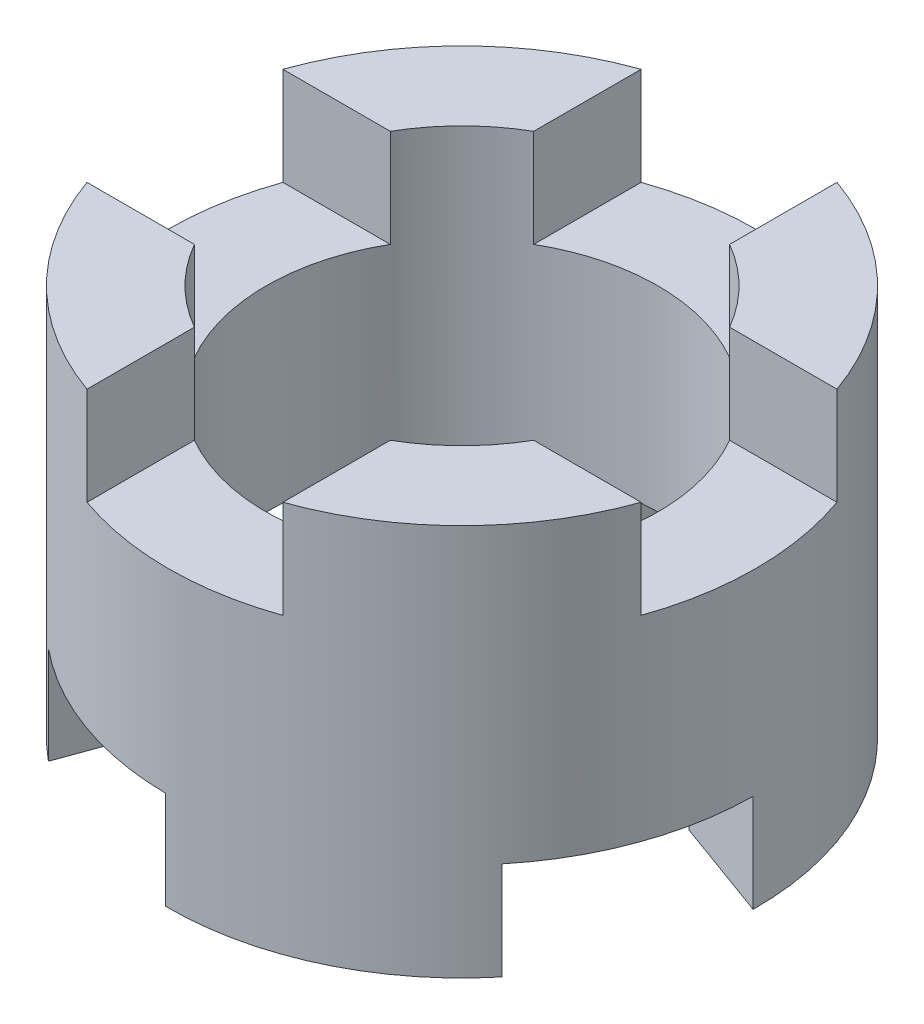
ISO-10303-21;
HEADER;
FILE_DESCRIPTION(('STEP AP214'),'2;1');
FILE_NAME('part.step','',(''),(''),'','','');
FILE_SCHEMA(('AUTOMOTIVE_DESIGN { 1 0 10303 214 1 1 1 1 }'));
ENDSEC;
DATA;
#1=APPLICATION_CONTEXT('core data for automotive mechanical design processes');
#2=APPLICATION_PROTOCOL_DEFINITION('international standard','automotive_design',2000,#1);
#3=PRODUCT_CONTEXT('',#1,'mechanical');
#4=PRODUCT('Part','Part','',(#3));
#5=PRODUCT_RELATED_PRODUCT_CATEGORY('part','',(#4));
#6=PRODUCT_DEFINITION_FORMATION('','',#4);
#7=PRODUCT_DEFINITION_CONTEXT('part definition',#1,'design');
#8=PRODUCT_DEFINITION('design','',#6,#7);
#9=PRODUCT_DEFINITION_SHAPE('','',#8);
#10=(LENGTH_UNIT() NAMED_UNIT(*) SI_UNIT(.MILLI.,.METRE.));
#11=(NAMED_UNIT(*) PLANE_ANGLE_UNIT() SI_UNIT($,.RADIAN.));
#12=(NAMED_UNIT(*) SI_UNIT($,.STERADIAN.) SOLID_ANGLE_UNIT());
#13=UNCERTAINTY_MEASURE_WITH_UNIT(LENGTH_MEASURE(1.E-05),#10,'distance_accuracy_value','');
#14=(GEOMETRIC_REPRESENTATION_CONTEXT(3) GLOBAL_UNCERTAINTY_ASSIGNED_CONTEXT((#13)) GLOBAL_UNIT_ASSIGNED_CONTEXT((#10,
#11,#12)) REPRESENTATION_CONTEXT('',''));
#15=CARTESIAN_POINT('',(0.,0.,0.));
#16=DIRECTION('',(0.,0.,1.));
#17=DIRECTION('',(1.,0.,0.));
#18=AXIS2_PLACEMENT_3D('',#15,#16,#17);
#19=CARTESIAN_POINT('',(0.,0.,0.));
#20=DIRECTION('',(0.,1.,0.));
#21=DIRECTION('',(0.,0.,1.));
#22=AXIS2_PLACEMENT_3D('',#19,#20,#21);
#23=PLANE('',#22);
#24=DIRECTION('',(0.342020143325653,0.,-0.939692620785914));
#25=VECTOR('',#24,1.);
#26=CARTESIAN_POINT('',(-7.03849959341292,0.,37.9042766407801));
#27=LINE('',#26,#25);
#28=CARTESIAN_POINT('',(-0.175808829267726,0.,19.0491887295903));
#29=VERTEX_POINT('',#28);
#30=CARTESIAN_POINT('',(2.20533185637023,0.,12.507058463255));
#31=VERTEX_POINT('',#30);
#32=EDGE_CURVE('E268',#29,#31,#27,.T.);
#33=ORIENTED_EDGE('',*,*,#32,.T.);
#34=CARTESIAN_POINT('',(0.,0.,0.));
#35=DIRECTION('',(0.,1.,0.));
#36=DIRECTION('',(0.,0.,1.));
#37=AXIS2_PLACEMENT_3D('',#34,#35,#36);
#38=CIRCLE('',#37,12.7);
#39=CARTESIAN_POINT('',(8.16340264301918,0.,9.72876442761091));
#40=VERTEX_POINT('',#39);
#41=EDGE_CURVE('E488',#31,#40,#38,.T.);
#42=ORIENTED_EDGE('',*,*,#41,.T.);
#43=DIRECTION('',(0.939692620785913,0.,0.342020143325656));
#44=VECTOR('',#43,1.);
#45=CARTESIAN_POINT('',(-37.90427664078,0.,-7.03849959341306));
#46=LINE('',#45,#44);
#47=CARTESIAN_POINT('',(14.7055329093545,0.,12.1099051132489));
#48=VERTEX_POINT('',#47);
#49=EDGE_CURVE('E415',#40,#48,#46,.T.);
#50=ORIENTED_EDGE('',*,*,#49,.T.);
#51=CARTESIAN_POINT('',(0.,0.,0.));
#52=DIRECTION('',(0.,1.,0.));
#53=DIRECTION('',(0.,0.,1.));
#54=AXIS2_PLACEMENT_3D('',#51,#52,#53);
#55=CIRCLE('',#54,19.05);
#56=EDGE_CURVE('E275',#29,#48,#55,.T.);
#57=ORIENTED_EDGE('',*,*,#56,.F.);
#58=EDGE_LOOP('',(#33,#42,#50,#57));
#59=FACE_BOUND('',#58,.T.);
#60=ADVANCED_FACE('F41',(#59),#23,.F.);
#61=CARTESIAN_POINT('',(0.,25.4,0.));
#62=DIRECTION('',(0.,-1.,0.));
#63=DIRECTION('',(0.,0.,-1.));
#64=AXIS2_PLACEMENT_3D('',#61,#62,#63);
#65=CYLINDRICAL_SURFACE('',#64,19.05);
#66=CARTESIAN_POINT('',(0.,19.05,0.));
#67=DIRECTION('',(0.,-1.,0.));
#68=DIRECTION('',(0.,0.,-1.));
#69=AXIS2_PLACEMENT_3D('',#66,#67,#68);
#70=CIRCLE('',#69,19.05);
#71=CARTESIAN_POINT('',(6.35000000000006,19.05,17.9605122421383));
#72=VERTEX_POINT('',#71);
#73=CARTESIAN_POINT('',(-6.34999999999994,19.05,17.9605122421383));
#74=VERTEX_POINT('',#73);
#75=EDGE_CURVE('E447',#72,#74,#70,.T.);
#76=ORIENTED_EDGE('',*,*,#75,.T.);
#77=DIRECTION('',(0.,-1.,0.));
#78=VECTOR('',#77,1.);
#79=CARTESIAN_POINT('',(-6.34999999999994,25.4,17.9605122421383));
#80=LINE('',#79,#78);
#81=CARTESIAN_POINT('',(-6.34999999999994,25.4,17.9605122421383));
#82=VERTEX_POINT('',#81);
#83=EDGE_CURVE('E454',#74,#82,#80,.F.);
#84=ORIENTED_EDGE('',*,*,#83,.T.);
#85=CARTESIAN_POINT('',(0.,25.4,0.));
#86=DIRECTION('',(0.,1.,0.));
#87=DIRECTION('',(0.,0.,1.));
#88=AXIS2_PLACEMENT_3D('',#85,#86,#87);
#89=CIRCLE('',#88,19.05);
#90=CARTESIAN_POINT('',(-17.9605122421383,25.4,6.34999999999999));
#91=VERTEX_POINT('',#90);
#92=EDGE_CURVE('E286',#91,#82,#89,.T.);
#93=ORIENTED_EDGE('',*,*,#92,.F.);
#94=DIRECTION('',(0.,-1.,0.));
#95=VECTOR('',#94,1.);
#96=CARTESIAN_POINT('',(-17.9605122421383,25.4,6.34999999999999));
#97=LINE('',#96,#95);
#98=CARTESIAN_POINT('',(-17.9605122421383,19.05,6.34999999999999));
#99=VERTEX_POINT('',#98);
#100=EDGE_CURVE('E479',#91,#99,#97,.T.);
#101=ORIENTED_EDGE('',*,*,#100,.T.);
#102=CARTESIAN_POINT('',(0.,19.05,0.));
#103=DIRECTION('',(0.,-1.,0.));
#104=DIRECTION('',(0.,0.,-1.));
#105=AXIS2_PLACEMENT_3D('',#102,#103,#104);
#106=CIRCLE('',#105,19.05);
#107=CARTESIAN_POINT('',(-17.9605122421383,19.05,-6.35));
#108=VERTEX_POINT('',#107);
#109=EDGE_CURVE('E472',#99,#108,#106,.T.);
#110=ORIENTED_EDGE('',*,*,#109,.T.);
#111=DIRECTION('',(0.,-1.,0.));
#112=VECTOR('',#111,1.);
#113=CARTESIAN_POINT('',(-17.9605122421383,25.4,-6.35));
#114=LINE('',#113,#112);
#115=CARTESIAN_POINT('',(-17.9605122421383,25.4,-6.35));
#116=VERTEX_POINT('',#115);
#117=EDGE_CURVE('E482',#108,#116,#114,.F.);
#118=ORIENTED_EDGE('',*,*,#117,.T.);
#119=CARTESIAN_POINT('',(-6.35000000000007,25.4,-17.9605122421383));
#120=VERTEX_POINT('',#119);
#121=EDGE_CURVE('E287',#120,#116,#89,.T.);
#122=ORIENTED_EDGE('',*,*,#121,.F.);
#123=DIRECTION('',(0.,-1.,0.));
#124=VECTOR('',#123,1.);
#125=CARTESIAN_POINT('',(-6.35000000000007,25.4,-17.9605122421383));
#126=LINE('',#125,#124);
#127=CARTESIAN_POINT('',(-6.35000000000007,19.05,-17.9605122421383));
#128=VERTEX_POINT('',#127);
#129=EDGE_CURVE('E457',#120,#128,#126,.T.);
#130=ORIENTED_EDGE('',*,*,#129,.T.);
#131=CARTESIAN_POINT('',(6.34999999999993,19.05,-17.9605122421383));
#132=VERTEX_POINT('',#131);
#133=EDGE_CURVE('E444',#128,#132,#70,.T.);
#134=ORIENTED_EDGE('',*,*,#133,.T.);
#135=DIRECTION('',(0.,-1.,0.));
#136=VECTOR('',#135,1.);
#137=CARTESIAN_POINT('',(6.34999999999993,25.4,-17.9605122421383));
#138=LINE('',#137,#136);
#139=CARTESIAN_POINT('',(6.34999999999993,25.4,-17.9605122421383));
#140=VERTEX_POINT('',#139);
#141=EDGE_CURVE('E448',#132,#140,#138,.F.);
#142=ORIENTED_EDGE('',*,*,#141,.T.);
#143=CARTESIAN_POINT('',(17.9605122421383,25.4,-6.35000000000001));
#144=VERTEX_POINT('',#143);
#145=EDGE_CURVE('E294',#144,#140,#89,.T.);
#146=ORIENTED_EDGE('',*,*,#145,.F.);
#147=DIRECTION('',(0.,-1.,0.));
#148=VECTOR('',#147,1.);
#149=CARTESIAN_POINT('',(17.9605122421383,25.4,-6.35000000000001));
#150=LINE('',#149,#148);
#151=CARTESIAN_POINT('',(17.9605122421383,19.05,-6.35000000000001));
#152=VERTEX_POINT('',#151);
#153=EDGE_CURVE('E485',#144,#152,#150,.T.);
#154=ORIENTED_EDGE('',*,*,#153,.T.);
#155=CARTESIAN_POINT('',(17.9605122421383,19.05,6.34999999999999));
#156=VERTEX_POINT('',#155);
#157=EDGE_CURVE('E475',#152,#156,#106,.T.);
#158=ORIENTED_EDGE('',*,*,#157,.T.);
#159=DIRECTION('',(0.,-1.,0.));
#160=VECTOR('',#159,1.);
#161=CARTESIAN_POINT('',(17.9605122421383,25.4,6.34999999999999));
#162=LINE('',#161,#160);
#163=CARTESIAN_POINT('',(17.9605122421383,25.4,6.34999999999999));
#164=VERTEX_POINT('',#163);
#165=EDGE_CURVE('E476',#156,#164,#162,.F.);
#166=ORIENTED_EDGE('',*,*,#165,.T.);
#167=CARTESIAN_POINT('',(6.35000000000006,25.4,17.9605122421383));
#168=VERTEX_POINT('',#167);
#169=EDGE_CURVE('E282',#168,#164,#89,.T.);
#170=ORIENTED_EDGE('',*,*,#169,.F.);
#171=DIRECTION('',(0.,-1.,0.));
#172=VECTOR('',#171,1.);
#173=CARTESIAN_POINT('',(6.35000000000006,25.4,17.9605122421383));
#174=LINE('',#173,#172);
#175=EDGE_CURVE('E451',#168,#72,#174,.T.);
#176=ORIENTED_EDGE('',*,*,#175,.T.);
#177=EDGE_LOOP('',(#76,#84,#93,#101,#110,#118,#122,#130,#134,#142,#146,#154,#158,#166,#170,#176));
#178=FACE_BOUND('',#177,.T.);
#179=DIRECTION('',(0.,-1.,0.));
#180=VECTOR('',#179,1.);
#181=CARTESIAN_POINT('',(-0.175808829267726,25.4,19.0491887295903));
#182=LINE('',#181,#180);
#183=CARTESIAN_POINT('',(-0.175808829267726,6.35,19.0491887295903));
#184=VERTEX_POINT('',#183);
#185=EDGE_CURVE('E396',#29,#184,#182,.F.);
#186=ORIENTED_EDGE('',*,*,#185,.F.);
#187=ORIENTED_EDGE('',*,*,#56,.T.);
#188=DIRECTION('',(0.,-1.,0.));
#189=VECTOR('',#188,1.);
#190=CARTESIAN_POINT('',(14.7055329093545,25.4,12.1099051132489));
#191=LINE('',#190,#189);
#192=CARTESIAN_POINT('',(14.7055329093545,6.35,12.1099051132489));
#193=VERTEX_POINT('',#192);
#194=EDGE_CURVE('E427',#193,#48,#191,.T.);
#195=ORIENTED_EDGE('',*,*,#194,.F.);
#196=CARTESIAN_POINT('',(0.,6.35,0.));
#197=DIRECTION('',(0.,-1.,0.));
#198=DIRECTION('',(0.,0.,-1.));
#199=AXIS2_PLACEMENT_3D('',#196,#197,#198);
#200=CIRCLE('',#199,19.05);
#201=CARTESIAN_POINT('',(19.0491887295903,6.35,0.175808829267793));
#202=VERTEX_POINT('',#201);
#203=EDGE_CURVE('E420',#202,#193,#200,.T.);
#204=ORIENTED_EDGE('',*,*,#203,.F.);
#205=DIRECTION('',(0.,-1.,0.));
#206=VECTOR('',#205,1.);
#207=CARTESIAN_POINT('',(19.0491887295903,25.4,0.175808829267794));
#208=LINE('',#207,#206);
#209=CARTESIAN_POINT('',(19.0491887295903,0.,0.175808829267793));
#210=VERTEX_POINT('',#209);
#211=EDGE_CURVE('E424',#202,#210,#208,.T.);
#212=ORIENTED_EDGE('',*,*,#211,.T.);
#213=CARTESIAN_POINT('',(12.1099051132488,0.,-14.7055329093545));
#214=VERTEX_POINT('',#213);
#215=EDGE_CURVE('E277',#210,#214,#55,.T.);
#216=ORIENTED_EDGE('',*,*,#215,.T.);
#217=DIRECTION('',(0.,-1.,0.));
#218=VECTOR('',#217,1.);
#219=CARTESIAN_POINT('',(12.1099051132488,25.4,-14.7055329093545));
#220=LINE('',#219,#218);
#221=CARTESIAN_POINT('',(12.1099051132488,6.35,-14.7055329093545));
#222=VERTEX_POINT('',#221);
#223=EDGE_CURVE('E398',#222,#214,#220,.T.);
#224=ORIENTED_EDGE('',*,*,#223,.F.);
#225=CARTESIAN_POINT('',(0.,6.35,0.));
#226=DIRECTION('',(0.,-1.,0.));
#227=DIRECTION('',(0.,0.,-1.));
#228=AXIS2_PLACEMENT_3D('',#225,#226,#227);
#229=CIRCLE('',#228,19.05);
#230=CARTESIAN_POINT('',(0.175808829267731,6.35,-19.0491887295903));
#231=VERTEX_POINT('',#230);
#232=EDGE_CURVE('E400',#231,#222,#229,.T.);
#233=ORIENTED_EDGE('',*,*,#232,.F.);
#234=DIRECTION('',(0.,-1.,0.));
#235=VECTOR('',#234,1.);
#236=CARTESIAN_POINT('',(0.17580882926773,25.4,-19.0491887295903));
#237=LINE('',#236,#235);
#238=CARTESIAN_POINT('',(0.17580882926773,0.,-19.0491887295903));
#239=VERTEX_POINT('',#238);
#240=EDGE_CURVE('E258',#231,#239,#237,.T.);
#241=ORIENTED_EDGE('',*,*,#240,.T.);
#242=CARTESIAN_POINT('',(-14.7055329093545,0.,-12.1099051132489));
#243=VERTEX_POINT('',#242);
#244=EDGE_CURVE('E274',#239,#243,#55,.T.);
#245=ORIENTED_EDGE('',*,*,#244,.T.);
#246=DIRECTION('',(0.,-1.,0.));
#247=VECTOR('',#246,1.);
#248=CARTESIAN_POINT('',(-14.7055329093545,25.4,-12.1099051132489));
#249=LINE('',#248,#247);
#250=CARTESIAN_POINT('',(-14.7055329093545,6.35,-12.1099051132489));
#251=VERTEX_POINT('',#250);
#252=EDGE_CURVE('E421',#243,#251,#249,.F.);
#253=ORIENTED_EDGE('',*,*,#252,.T.);
#254=CARTESIAN_POINT('',(-19.0491887295903,6.35,-0.175808829267795));
#255=VERTEX_POINT('',#254);
#256=EDGE_CURVE('E418',#255,#251,#200,.T.);
#257=ORIENTED_EDGE('',*,*,#256,.F.);
#258=DIRECTION('',(0.,-1.,0.));
#259=VECTOR('',#258,1.);
#260=CARTESIAN_POINT('',(-19.0491887295903,25.4,-0.175808829267794));
#261=LINE('',#260,#259);
#262=CARTESIAN_POINT('',(-19.0491887295903,0.,-0.175808829267795));
#263=VERTEX_POINT('',#262);
#264=EDGE_CURVE('E273',#263,#255,#261,.F.);
#265=ORIENTED_EDGE('',*,*,#264,.F.);
#266=CARTESIAN_POINT('',(-12.1099051132488,0.,14.7055329093545));
#267=VERTEX_POINT('',#266);
#268=EDGE_CURVE('E265',#263,#267,#55,.T.);
#269=ORIENTED_EDGE('',*,*,#268,.T.);
#270=DIRECTION('',(0.,-1.,0.));
#271=VECTOR('',#270,1.);
#272=CARTESIAN_POINT('',(-12.1099051132488,25.4,14.7055329093545));
#273=LINE('',#272,#271);
#274=CARTESIAN_POINT('',(-12.1099051132488,6.35,14.7055329093545));
#275=VERTEX_POINT('',#274);
#276=EDGE_CURVE('E250',#267,#275,#273,.F.);
#277=ORIENTED_EDGE('',*,*,#276,.T.);
#278=EDGE_CURVE('E402',#184,#275,#229,.T.);
#279=ORIENTED_EDGE('',*,*,#278,.F.);
#280=EDGE_LOOP('',(#186,#187,#195,#204,#212,#216,#224,#233,#241,#245,#253,#257,#265,#269,#277,#279));
#281=FACE_BOUND('',#280,.T.);
#282=ADVANCED_FACE('F43',(#178,#281),#65,.T.);
#283=CARTESIAN_POINT('',(0.,25.4,0.));
#284=DIRECTION('',(0.,-1.,0.));
#285=DIRECTION('',(0.,0.,-1.));
#286=AXIS2_PLACEMENT_3D('',#283,#284,#285);
#287=CYLINDRICAL_SURFACE('',#286,12.7);
#288=DIRECTION('',(0.,-1.,0.));
#289=VECTOR('',#288,1.);
#290=CARTESIAN_POINT('',(-6.34999999999997,25.4,10.9985226280624));
#291=LINE('',#290,#289);
#292=CARTESIAN_POINT('',(-6.34999999999997,19.05,10.9985226280624));
#293=VERTEX_POINT('',#292);
#294=CARTESIAN_POINT('',(-6.34999999999997,25.4,10.9985226280624));
#295=VERTEX_POINT('',#294);
#296=EDGE_CURVE('E342',#293,#295,#291,.F.);
#297=ORIENTED_EDGE('',*,*,#296,.F.);
#298=CARTESIAN_POINT('',(0.,19.05,0.));
#299=DIRECTION('',(0.,-1.,0.));
#300=DIRECTION('',(0.,0.,-1.));
#301=AXIS2_PLACEMENT_3D('',#298,#299,#300);
#302=CIRCLE('',#301,12.7);
#303=CARTESIAN_POINT('',(6.35000000000003,19.05,10.9985226280624));
#304=VERTEX_POINT('',#303);
#305=EDGE_CURVE('E334',#304,#293,#302,.T.);
#306=ORIENTED_EDGE('',*,*,#305,.F.);
#307=DIRECTION('',(0.,-1.,0.));
#308=VECTOR('',#307,1.);
#309=CARTESIAN_POINT('',(6.35000000000003,25.4,10.9985226280624));
#310=LINE('',#309,#308);
#311=CARTESIAN_POINT('',(6.35000000000003,25.4,10.9985226280624));
#312=VERTEX_POINT('',#311);
#313=EDGE_CURVE('E339',#312,#304,#310,.T.);
#314=ORIENTED_EDGE('',*,*,#313,.F.);
#315=CARTESIAN_POINT('',(0.,25.4,0.));
#316=DIRECTION('',(0.,1.,0.));
#317=DIRECTION('',(0.,0.,1.));
#318=AXIS2_PLACEMENT_3D('',#315,#316,#317);
#319=CIRCLE('',#318,12.7);
#320=CARTESIAN_POINT('',(10.9985226280624,25.4,6.34999999999999));
#321=VERTEX_POINT('',#320);
#322=EDGE_CURVE('E492',#312,#321,#319,.T.);
#323=ORIENTED_EDGE('',*,*,#322,.T.);
#324=DIRECTION('',(0.,-1.,0.));
#325=VECTOR('',#324,1.);
#326=CARTESIAN_POINT('',(10.9985226280624,25.4,6.34999999999999));
#327=LINE('',#326,#325);
#328=CARTESIAN_POINT('',(10.9985226280624,19.05,6.34999999999999));
#329=VERTEX_POINT('',#328);
#330=EDGE_CURVE('E316',#329,#321,#327,.F.);
#331=ORIENTED_EDGE('',*,*,#330,.F.);
#332=CARTESIAN_POINT('',(0.,19.05,0.));
#333=DIRECTION('',(0.,-1.,0.));
#334=DIRECTION('',(0.,0.,-1.));
#335=AXIS2_PLACEMENT_3D('',#332,#333,#334);
#336=CIRCLE('',#335,12.7);
#337=CARTESIAN_POINT('',(10.9985226280624,19.05,-6.35000000000001));
#338=VERTEX_POINT('',#337);
#339=EDGE_CURVE('E308',#338,#329,#336,.T.);
#340=ORIENTED_EDGE('',*,*,#339,.F.);
#341=DIRECTION('',(0.,-1.,0.));
#342=VECTOR('',#341,1.);
#343=CARTESIAN_POINT('',(10.9985226280624,25.4,-6.35000000000001));
#344=LINE('',#343,#342);
#345=CARTESIAN_POINT('',(10.9985226280624,25.4,-6.35000000000001));
#346=VERTEX_POINT('',#345);
#347=EDGE_CURVE('E322',#346,#338,#344,.T.);
#348=ORIENTED_EDGE('',*,*,#347,.F.);
#349=CARTESIAN_POINT('',(6.34999999999995,25.4,-10.9985226280624));
#350=VERTEX_POINT('',#349);
#351=EDGE_CURVE('E278',#346,#350,#319,.T.);
#352=ORIENTED_EDGE('',*,*,#351,.T.);
#353=DIRECTION('',(0.,-1.,0.));
#354=VECTOR('',#353,1.);
#355=CARTESIAN_POINT('',(6.34999999999995,25.4,-10.9985226280624));
#356=LINE('',#355,#354);
#357=CARTESIAN_POINT('',(6.34999999999995,19.05,-10.9985226280624));
#358=VERTEX_POINT('',#357);
#359=EDGE_CURVE('E333',#358,#350,#356,.F.);
#360=ORIENTED_EDGE('',*,*,#359,.F.);
#361=CARTESIAN_POINT('',(-6.35000000000005,19.05,-10.9985226280623));
#362=VERTEX_POINT('',#361);
#363=EDGE_CURVE('E331',#362,#358,#302,.T.);
#364=ORIENTED_EDGE('',*,*,#363,.F.);
#365=DIRECTION('',(0.,-1.,0.));
#366=VECTOR('',#365,1.);
#367=CARTESIAN_POINT('',(-6.35000000000005,25.4,-10.9985226280623));
#368=LINE('',#367,#366);
#369=CARTESIAN_POINT('',(-6.35000000000005,25.4,-10.9985226280623));
#370=VERTEX_POINT('',#369);
#371=EDGE_CURVE('E336',#370,#362,#368,.T.);
#372=ORIENTED_EDGE('',*,*,#371,.F.);
#373=CARTESIAN_POINT('',(-10.9985226280624,25.4,-6.35000000000001));
#374=VERTEX_POINT('',#373);
#375=EDGE_CURVE('E491',#370,#374,#319,.T.);
#376=ORIENTED_EDGE('',*,*,#375,.T.);
#377=DIRECTION('',(0.,-1.,0.));
#378=VECTOR('',#377,1.);
#379=CARTESIAN_POINT('',(-10.9985226280624,25.4,-6.35000000000001));
#380=LINE('',#379,#378);
#381=CARTESIAN_POINT('',(-10.9985226280624,19.05,-6.35000000000001));
#382=VERTEX_POINT('',#381);
#383=EDGE_CURVE('E314',#382,#374,#380,.F.);
#384=ORIENTED_EDGE('',*,*,#383,.F.);
#385=CARTESIAN_POINT('',(-10.9985226280624,19.05,6.34999999999999));
#386=VERTEX_POINT('',#385);
#387=EDGE_CURVE('E302',#386,#382,#336,.T.);
#388=ORIENTED_EDGE('',*,*,#387,.F.);
#389=DIRECTION('',(0.,-1.,0.));
#390=VECTOR('',#389,1.);
#391=CARTESIAN_POINT('',(-10.9985226280624,25.4,6.34999999999999));
#392=LINE('',#391,#390);
#393=CARTESIAN_POINT('',(-10.9985226280624,25.4,6.34999999999999));
#394=VERTEX_POINT('',#393);
#395=EDGE_CURVE('E307',#394,#386,#392,.T.);
#396=ORIENTED_EDGE('',*,*,#395,.F.);
#397=EDGE_CURVE('E489',#394,#295,#319,.T.);
#398=ORIENTED_EDGE('',*,*,#397,.T.);
#399=EDGE_LOOP('',(#297,#306,#314,#323,#331,#340,#348,#352,#360,#364,#372,#376,#384,#388,#396,#398));
#400=FACE_BOUND('',#399,.T.);
#401=ORIENTED_EDGE('',*,*,#41,.F.);
#402=DIRECTION('',(0.,-1.,0.));
#403=VECTOR('',#402,1.);
#404=CARTESIAN_POINT('',(2.20533185637023,25.4,12.507058463255));
#405=LINE('',#404,#403);
#406=CARTESIAN_POINT('',(2.20533185637023,6.35,12.507058463255));
#407=VERTEX_POINT('',#406);
#408=EDGE_CURVE('E392',#31,#407,#405,.F.);
#409=ORIENTED_EDGE('',*,*,#408,.T.);
#410=CARTESIAN_POINT('',(0.,6.35,0.));
#411=DIRECTION('',(0.,-1.,0.));
#412=DIRECTION('',(0.,0.,-1.));
#413=AXIS2_PLACEMENT_3D('',#410,#411,#412);
#414=CIRCLE('',#413,12.7);
#415=CARTESIAN_POINT('',(-9.72876442761088,6.35,8.16340264301922));
#416=VERTEX_POINT('',#415);
#417=EDGE_CURVE('E12',#407,#416,#414,.T.);
#418=ORIENTED_EDGE('',*,*,#417,.T.);
#419=DIRECTION('',(0.,-1.,0.));
#420=VECTOR('',#419,1.);
#421=CARTESIAN_POINT('',(-9.72876442761088,25.4,8.16340264301922));
#422=LINE('',#421,#420);
#423=CARTESIAN_POINT('',(-9.72876442761088,0.,8.16340264301922));
#424=VERTEX_POINT('',#423);
#425=EDGE_CURVE('E388',#424,#416,#422,.F.);
#426=ORIENTED_EDGE('',*,*,#425,.F.);
#427=CARTESIAN_POINT('',(-12.507058463255,0.,2.20533185637018));
#428=VERTEX_POINT('',#427);
#429=EDGE_CURVE('E267',#428,#424,#38,.T.);
#430=ORIENTED_EDGE('',*,*,#429,.F.);
#431=DIRECTION('',(0.,-1.,0.));
#432=VECTOR('',#431,1.);
#433=CARTESIAN_POINT('',(-12.507058463255,25.4,2.20533185637018));
#434=LINE('',#433,#432);
#435=CARTESIAN_POINT('',(-12.507058463255,6.35,2.20533185637018));
#436=VERTEX_POINT('',#435);
#437=EDGE_CURVE('E351',#428,#436,#434,.F.);
#438=ORIENTED_EDGE('',*,*,#437,.T.);
#439=CARTESIAN_POINT('',(0.,6.35,0.));
#440=DIRECTION('',(0.,-1.,0.));
#441=DIRECTION('',(0.,0.,-1.));
#442=AXIS2_PLACEMENT_3D('',#439,#440,#441);
#443=CIRCLE('',#442,12.7);
#444=CARTESIAN_POINT('',(-8.16340264301918,6.35,-9.72876442761091));
#445=VERTEX_POINT('',#444);
#446=EDGE_CURVE('E344',#436,#445,#443,.T.);
#447=ORIENTED_EDGE('',*,*,#446,.T.);
#448=DIRECTION('',(0.,-1.,0.));
#449=VECTOR('',#448,1.);
#450=CARTESIAN_POINT('',(-8.16340264301918,25.4,-9.72876442761091));
#451=LINE('',#450,#449);
#452=CARTESIAN_POINT('',(-8.16340264301918,0.,-9.72876442761091));
#453=VERTEX_POINT('',#452);
#454=EDGE_CURVE('E347',#453,#445,#451,.F.);
#455=ORIENTED_EDGE('',*,*,#454,.F.);
#456=CARTESIAN_POINT('',(-2.20533185637023,0.,-12.507058463255));
#457=VERTEX_POINT('',#456);
#458=EDGE_CURVE('E493',#457,#453,#38,.T.);
#459=ORIENTED_EDGE('',*,*,#458,.F.);
#460=DIRECTION('',(0.,-1.,0.));
#461=VECTOR('',#460,1.);
#462=CARTESIAN_POINT('',(-2.20533185637023,25.4,-12.507058463255));
#463=LINE('',#462,#461);
#464=CARTESIAN_POINT('',(-2.20533185637022,6.35,-12.507058463255));
#465=VERTEX_POINT('',#464);
#466=EDGE_CURVE('E64',#465,#457,#463,.T.);
#467=ORIENTED_EDGE('',*,*,#466,.F.);
#468=CARTESIAN_POINT('',(9.72876442761088,6.35,-8.16340264301921));
#469=VERTEX_POINT('',#468);
#470=EDGE_CURVE('E45',#465,#469,#414,.T.);
#471=ORIENTED_EDGE('',*,*,#470,.T.);
#472=DIRECTION('',(0.,-1.,0.));
#473=VECTOR('',#472,1.);
#474=CARTESIAN_POINT('',(9.72876442761088,25.4,-8.16340264301921));
#475=LINE('',#474,#473);
#476=CARTESIAN_POINT('',(9.72876442761088,0.,-8.16340264301921));
#477=VERTEX_POINT('',#476);
#478=EDGE_CURVE('E369',#469,#477,#475,.T.);
#479=ORIENTED_EDGE('',*,*,#478,.T.);
#480=CARTESIAN_POINT('',(12.507058463255,0.,-2.20533185637019));
#481=VERTEX_POINT('',#480);
#482=EDGE_CURVE('E494',#481,#477,#38,.T.);
#483=ORIENTED_EDGE('',*,*,#482,.F.);
#484=DIRECTION('',(0.,-1.,0.));
#485=VECTOR('',#484,1.);
#486=CARTESIAN_POINT('',(12.507058463255,25.4,-2.20533185637019));
#487=LINE('',#486,#485);
#488=CARTESIAN_POINT('',(12.507058463255,6.35,-2.20533185637019));
#489=VERTEX_POINT('',#488);
#490=EDGE_CURVE('E354',#489,#481,#487,.T.);
#491=ORIENTED_EDGE('',*,*,#490,.F.);
#492=CARTESIAN_POINT('',(8.16340264301918,6.35,9.72876442761091));
#493=VERTEX_POINT('',#492);
#494=EDGE_CURVE('E348',#489,#493,#443,.T.);
#495=ORIENTED_EDGE('',*,*,#494,.T.);
#496=DIRECTION('',(0.,-1.,0.));
#497=VECTOR('',#496,1.);
#498=CARTESIAN_POINT('',(8.16340264301918,25.4,9.72876442761091));
#499=LINE('',#498,#497);
#500=EDGE_CURVE('E356',#493,#40,#499,.T.);
#501=ORIENTED_EDGE('',*,*,#500,.T.);
#502=EDGE_LOOP('',(#401,#409,#418,#426,#430,#438,#447,#455,#459,#467,#471,#479,#483,#491,#495,#501));
#503=FACE_BOUND('',#502,.T.);
#504=ADVANCED_FACE('F367',(#400,#503),#287,.F.);
#505=DIRECTION('',(-0.342020143325653,0.,0.939692620785914));
#506=VECTOR('',#505,1.);
#507=CARTESIAN_POINT('',(5.96704814199055,0.,2.17182791011789));
#508=LINE('',#507,#506);
#509=EDGE_CURVE('E360',#214,#477,#508,.T.);
#510=ORIENTED_EDGE('',*,*,#509,.F.);
#511=ORIENTED_EDGE('',*,*,#215,.F.);
#512=DIRECTION('',(0.939692620785913,0.,0.342020143325656));
#513=VECTOR('',#512,1.);
#514=CARTESIAN_POINT('',(-33.5606208205442,0.,-18.9725958773942));
#515=LINE('',#514,#513);
#516=EDGE_CURVE('E412',#481,#210,#515,.T.);
#517=ORIENTED_EDGE('',*,*,#516,.F.);
#518=ORIENTED_EDGE('',*,*,#482,.T.);
#519=EDGE_LOOP('',(#510,#511,#517,#518));
#520=FACE_BOUND('',#519,.T.);
#521=ADVANCED_FACE('F560',(#520),#23,.F.);
#522=ORIENTED_EDGE('',*,*,#429,.T.);
#523=DIRECTION('',(0.342020143325653,0.,-0.939692620785914));
#524=VECTOR('',#523,1.);
#525=CARTESIAN_POINT('',(-18.972595877394,0.,33.5606208205443));
#526=LINE('',#525,#524);
#527=EDGE_CURVE('E253',#267,#424,#526,.T.);
#528=ORIENTED_EDGE('',*,*,#527,.F.);
#529=ORIENTED_EDGE('',*,*,#268,.F.);
#530=EDGE_CURVE('E407',#263,#428,#46,.T.);
#531=ORIENTED_EDGE('',*,*,#530,.T.);
#532=EDGE_LOOP('',(#522,#528,#529,#531));
#533=FACE_BOUND('',#532,.T.);
#534=ADVANCED_FACE('F263',(#533),#23,.F.);
#535=CARTESIAN_POINT('',(0.,25.4,0.));
#536=DIRECTION('',(0.,1.,0.));
#537=DIRECTION('',(0.,0.,1.));
#538=AXIS2_PLACEMENT_3D('',#535,#536,#537);
#539=PLANE('',#538);
#540=DIRECTION('',(0.,0.,1.));
#541=VECTOR('',#540,1.);
#542=CARTESIAN_POINT('',(-6.35000000000028,25.4,-74.6775557610133));
#543=LINE('',#542,#541);
#544=EDGE_CURVE('E435',#120,#370,#543,.T.);
#545=ORIENTED_EDGE('',*,*,#544,.F.);
#546=ORIENTED_EDGE('',*,*,#121,.T.);
#547=DIRECTION('',(-1.,0.,0.));
#548=VECTOR('',#547,1.);
#549=CARTESIAN_POINT('',(74.6775557610133,25.4,-6.35000000000002));
#550=LINE('',#549,#548);
#551=EDGE_CURVE('E470',#374,#116,#550,.T.);
#552=ORIENTED_EDGE('',*,*,#551,.F.);
#553=ORIENTED_EDGE('',*,*,#375,.F.);
#554=EDGE_LOOP('',(#545,#546,#552,#553));
#555=FACE_BOUND('',#554,.T.);
#556=ADVANCED_FACE('F520',(#555),#539,.T.);
#557=EDGE_CURVE('E442',#295,#82,#543,.T.);
#558=ORIENTED_EDGE('',*,*,#557,.F.);
#559=ORIENTED_EDGE('',*,*,#397,.F.);
#560=DIRECTION('',(1.,0.,0.));
#561=VECTOR('',#560,1.);
#562=CARTESIAN_POINT('',(74.6775557610133,25.4,6.34999999999998));
#563=LINE('',#562,#561);
#564=EDGE_CURVE('E469',#91,#394,#563,.T.);
#565=ORIENTED_EDGE('',*,*,#564,.F.);
#566=ORIENTED_EDGE('',*,*,#92,.T.);
#567=EDGE_LOOP('',(#558,#559,#565,#566));
#568=FACE_BOUND('',#567,.T.);
#569=ADVANCED_FACE('F532',(#568),#539,.T.);
#570=DIRECTION('',(0.,0.,-1.));
#571=VECTOR('',#570,1.);
#572=CARTESIAN_POINT('',(6.34999999999972,25.4,-74.6775557610134));
#573=LINE('',#572,#571);
#574=EDGE_CURVE('E430',#350,#140,#573,.T.);
#575=ORIENTED_EDGE('',*,*,#574,.F.);
#576=ORIENTED_EDGE('',*,*,#351,.F.);
#577=EDGE_CURVE('E464',#144,#346,#550,.T.);
#578=ORIENTED_EDGE('',*,*,#577,.F.);
#579=ORIENTED_EDGE('',*,*,#145,.T.);
#580=EDGE_LOOP('',(#575,#576,#578,#579));
#581=FACE_BOUND('',#580,.T.);
#582=ADVANCED_FACE('F509',(#581),#539,.T.);
#583=EDGE_CURVE('E441',#168,#312,#573,.T.);
#584=ORIENTED_EDGE('',*,*,#583,.F.);
#585=ORIENTED_EDGE('',*,*,#169,.T.);
#586=EDGE_CURVE('E460',#321,#164,#563,.T.);
#587=ORIENTED_EDGE('',*,*,#586,.F.);
#588=ORIENTED_EDGE('',*,*,#322,.F.);
#589=EDGE_LOOP('',(#584,#585,#587,#588));
#590=FACE_BOUND('',#589,.T.);
#591=ADVANCED_FACE('F542',(#590),#539,.T.);
#592=ORIENTED_EDGE('',*,*,#244,.F.);
#593=DIRECTION('',(-0.342020143325653,0.,0.939692620785914));
#594=VECTOR('',#593,1.);
#595=CARTESIAN_POINT('',(-5.96704814199055,0.,-2.17182791011789));
#596=LINE('',#595,#594);
#597=EDGE_CURVE('E359',#239,#457,#596,.T.);
#598=ORIENTED_EDGE('',*,*,#597,.T.);
#599=ORIENTED_EDGE('',*,*,#458,.T.);
#600=EDGE_CURVE('E414',#243,#453,#515,.T.);
#601=ORIENTED_EDGE('',*,*,#600,.F.);
#602=EDGE_LOOP('',(#592,#598,#599,#601));
#603=FACE_BOUND('',#602,.T.);
#604=ADVANCED_FACE('F561',(#603),#23,.F.);
#605=CARTESIAN_POINT('',(0.,19.05,0.));
#606=DIRECTION('',(0.,-1.,0.));
#607=DIRECTION('',(0.,0.,-1.));
#608=AXIS2_PLACEMENT_3D('',#605,#606,#607);
#609=PLANE('',#608);
#610=DIRECTION('',(1.,0.,0.));
#611=VECTOR('',#610,1.);
#612=CARTESIAN_POINT('',(74.6775557610133,19.05,6.34999999999998));
#613=LINE('',#612,#611);
#614=EDGE_CURVE('E463',#99,#386,#613,.T.);
#615=ORIENTED_EDGE('',*,*,#614,.T.);
#616=ORIENTED_EDGE('',*,*,#387,.T.);
#617=DIRECTION('',(-1.,0.,0.));
#618=VECTOR('',#617,1.);
#619=CARTESIAN_POINT('',(74.6775557610133,19.05,-6.35000000000002));
#620=LINE('',#619,#618);
#621=EDGE_CURVE('E465',#382,#108,#620,.T.);
#622=ORIENTED_EDGE('',*,*,#621,.T.);
#623=ORIENTED_EDGE('',*,*,#109,.F.);
#624=EDGE_LOOP('',(#615,#616,#622,#623));
#625=FACE_BOUND('',#624,.T.);
#626=ADVANCED_FACE('F524',(#625),#609,.F.);
#627=CARTESIAN_POINT('',(74.6775557610133,19.05,6.34999999999998));
#628=DIRECTION('',(0.,0.,1.));
#629=DIRECTION('',(1.,0.,0.));
#630=AXIS2_PLACEMENT_3D('',#627,#628,#629);
#631=PLANE('',#630);
#632=ORIENTED_EDGE('',*,*,#564,.T.);
#633=ORIENTED_EDGE('',*,*,#395,.T.);
#634=ORIENTED_EDGE('',*,*,#614,.F.);
#635=ORIENTED_EDGE('',*,*,#100,.F.);
#636=EDGE_LOOP('',(#632,#633,#634,#635));
#637=FACE_BOUND('',#636,.T.);
#638=ADVANCED_FACE('F526',(#637),#631,.F.);
#639=CARTESIAN_POINT('',(74.6775557610133,19.05,-6.35000000000002));
#640=DIRECTION('',(0.,0.,-1.));
#641=DIRECTION('',(-1.,0.,0.));
#642=AXIS2_PLACEMENT_3D('',#639,#640,#641);
#643=PLANE('',#642);
#644=ORIENTED_EDGE('',*,*,#621,.F.);
#645=ORIENTED_EDGE('',*,*,#383,.T.);
#646=ORIENTED_EDGE('',*,*,#551,.T.);
#647=ORIENTED_EDGE('',*,*,#117,.F.);
#648=EDGE_LOOP('',(#644,#645,#646,#647));
#649=FACE_BOUND('',#648,.T.);
#650=ADVANCED_FACE('F521',(#649),#643,.F.);
#651=ORIENTED_EDGE('',*,*,#577,.T.);
#652=ORIENTED_EDGE('',*,*,#347,.T.);
#653=EDGE_CURVE('E467',#152,#338,#620,.T.);
#654=ORIENTED_EDGE('',*,*,#653,.F.);
#655=ORIENTED_EDGE('',*,*,#153,.F.);
#656=EDGE_LOOP('',(#651,#652,#654,#655));
#657=FACE_BOUND('',#656,.T.);
#658=ADVANCED_FACE('F549',(#657),#643,.F.);
#659=EDGE_CURVE('E461',#329,#156,#613,.T.);
#660=ORIENTED_EDGE('',*,*,#659,.F.);
#661=ORIENTED_EDGE('',*,*,#330,.T.);
#662=ORIENTED_EDGE('',*,*,#586,.T.);
#663=ORIENTED_EDGE('',*,*,#165,.F.);
#664=EDGE_LOOP('',(#660,#661,#662,#663));
#665=FACE_BOUND('',#664,.T.);
#666=ADVANCED_FACE('F544',(#665),#631,.F.);
#667=ORIENTED_EDGE('',*,*,#653,.T.);
#668=ORIENTED_EDGE('',*,*,#339,.T.);
#669=ORIENTED_EDGE('',*,*,#659,.T.);
#670=ORIENTED_EDGE('',*,*,#157,.F.);
#671=EDGE_LOOP('',(#667,#668,#669,#670));
#672=FACE_BOUND('',#671,.T.);
#673=ADVANCED_FACE('F547',(#672),#609,.F.);
#674=CARTESIAN_POINT('',(0.,19.05,0.));
#675=DIRECTION('',(0.,-1.,0.));
#676=DIRECTION('',(-1.,0.,0.));
#677=AXIS2_PLACEMENT_3D('',#674,#675,#676);
#678=PLANE('',#677);
#679=DIRECTION('',(0.,0.,1.));
#680=VECTOR('',#679,1.);
#681=CARTESIAN_POINT('',(-6.35000000000028,19.05,-74.6775557610133));
#682=LINE('',#681,#680);
#683=EDGE_CURVE('E439',#128,#362,#682,.T.);
#684=ORIENTED_EDGE('',*,*,#683,.T.);
#685=ORIENTED_EDGE('',*,*,#363,.T.);
#686=DIRECTION('',(0.,0.,-1.));
#687=VECTOR('',#686,1.);
#688=CARTESIAN_POINT('',(6.34999999999972,19.05,-74.6775557610134));
#689=LINE('',#688,#687);
#690=EDGE_CURVE('E431',#358,#132,#689,.T.);
#691=ORIENTED_EDGE('',*,*,#690,.T.);
#692=ORIENTED_EDGE('',*,*,#133,.F.);
#693=EDGE_LOOP('',(#684,#685,#691,#692));
#694=FACE_BOUND('',#693,.T.);
#695=ADVANCED_FACE('F517',(#694),#678,.F.);
#696=CARTESIAN_POINT('',(6.34999999999972,19.05,-74.6775557610134));
#697=DIRECTION('',(1.,0.,0.));
#698=DIRECTION('',(0.,0.,-1.));
#699=AXIS2_PLACEMENT_3D('',#696,#697,#698);
#700=PLANE('',#699);
#701=ORIENTED_EDGE('',*,*,#690,.F.);
#702=ORIENTED_EDGE('',*,*,#359,.T.);
#703=ORIENTED_EDGE('',*,*,#574,.T.);
#704=ORIENTED_EDGE('',*,*,#141,.F.);
#705=EDGE_LOOP('',(#701,#702,#703,#704));
#706=FACE_BOUND('',#705,.T.);
#707=ADVANCED_FACE('F512',(#706),#700,.F.);
#708=CARTESIAN_POINT('',(-6.35000000000028,19.05,-74.6775557610133));
#709=DIRECTION('',(-1.,0.,0.));
#710=DIRECTION('',(0.,0.,1.));
#711=AXIS2_PLACEMENT_3D('',#708,#709,#710);
#712=PLANE('',#711);
#713=ORIENTED_EDGE('',*,*,#544,.T.);
#714=ORIENTED_EDGE('',*,*,#371,.T.);
#715=ORIENTED_EDGE('',*,*,#683,.F.);
#716=ORIENTED_EDGE('',*,*,#129,.F.);
#717=EDGE_LOOP('',(#713,#714,#715,#716));
#718=FACE_BOUND('',#717,.T.);
#719=ADVANCED_FACE('F519',(#718),#712,.F.);
#720=EDGE_CURVE('E436',#293,#74,#682,.T.);
#721=ORIENTED_EDGE('',*,*,#720,.F.);
#722=ORIENTED_EDGE('',*,*,#296,.T.);
#723=ORIENTED_EDGE('',*,*,#557,.T.);
#724=ORIENTED_EDGE('',*,*,#83,.F.);
#725=EDGE_LOOP('',(#721,#722,#723,#724));
#726=FACE_BOUND('',#725,.T.);
#727=ADVANCED_FACE('F535',(#726),#712,.F.);
#728=ORIENTED_EDGE('',*,*,#583,.T.);
#729=ORIENTED_EDGE('',*,*,#313,.T.);
#730=EDGE_CURVE('E434',#72,#304,#689,.T.);
#731=ORIENTED_EDGE('',*,*,#730,.F.);
#732=ORIENTED_EDGE('',*,*,#175,.F.);
#733=EDGE_LOOP('',(#728,#729,#731,#732));
#734=FACE_BOUND('',#733,.T.);
#735=ADVANCED_FACE('F540',(#734),#700,.F.);
#736=ORIENTED_EDGE('',*,*,#730,.T.);
#737=ORIENTED_EDGE('',*,*,#305,.T.);
#738=ORIENTED_EDGE('',*,*,#720,.T.);
#739=ORIENTED_EDGE('',*,*,#75,.F.);
#740=EDGE_LOOP('',(#736,#737,#738,#739));
#741=FACE_BOUND('',#740,.T.);
#742=ADVANCED_FACE('F538',(#741),#678,.F.);
#743=CARTESIAN_POINT('',(0.,6.35,0.));
#744=DIRECTION('',(0.,-1.,0.));
#745=DIRECTION('',(0.,0.,-1.));
#746=AXIS2_PLACEMENT_3D('',#743,#744,#745);
#747=PLANE('',#746);
#748=ORIENTED_EDGE('',*,*,#256,.T.);
#749=DIRECTION('',(0.939692620785913,0.,0.342020143325656));
#750=VECTOR('',#749,1.);
#751=CARTESIAN_POINT('',(-33.5606208205442,6.35,-18.9725958773942));
#752=LINE('',#751,#750);
#753=EDGE_CURVE('E406',#251,#445,#752,.T.);
#754=ORIENTED_EDGE('',*,*,#753,.T.);
#755=ORIENTED_EDGE('',*,*,#446,.F.);
#756=DIRECTION('',(0.939692620785913,0.,0.342020143325656));
#757=VECTOR('',#756,1.);
#758=CARTESIAN_POINT('',(-37.90427664078,6.35,-7.03849959341306));
#759=LINE('',#758,#757);
#760=EDGE_CURVE('E411',#255,#436,#759,.T.);
#761=ORIENTED_EDGE('',*,*,#760,.F.);
#762=EDGE_LOOP('',(#748,#754,#755,#761));
#763=FACE_BOUND('',#762,.T.);
#764=ADVANCED_FACE('F681',(#763),#747,.T.);
#765=CARTESIAN_POINT('',(-33.5606208205442,6.35,-18.9725958773942));
#766=DIRECTION('',(0.342020143325656,0.,-0.939692620785913));
#767=DIRECTION('',(-0.939692620785913,0.,-0.342020143325656));
#768=AXIS2_PLACEMENT_3D('',#765,#766,#767);
#769=PLANE('',#768);
#770=ORIENTED_EDGE('',*,*,#600,.T.);
#771=ORIENTED_EDGE('',*,*,#454,.T.);
#772=ORIENTED_EDGE('',*,*,#753,.F.);
#773=ORIENTED_EDGE('',*,*,#252,.F.);
#774=EDGE_LOOP('',(#770,#771,#772,#773));
#775=FACE_BOUND('',#774,.T.);
#776=ADVANCED_FACE('F690',(#775),#769,.F.);
#777=CARTESIAN_POINT('',(-37.90427664078,6.35,-7.03849959341306));
#778=DIRECTION('',(0.342020143325656,0.,-0.939692620785913));
#779=DIRECTION('',(-0.939692620785913,0.,-0.342020143325656));
#780=AXIS2_PLACEMENT_3D('',#777,#778,#779);
#781=PLANE('',#780);
#782=ORIENTED_EDGE('',*,*,#264,.T.);
#783=ORIENTED_EDGE('',*,*,#760,.T.);
#784=ORIENTED_EDGE('',*,*,#437,.F.);
#785=ORIENTED_EDGE('',*,*,#530,.F.);
#786=EDGE_LOOP('',(#782,#783,#784,#785));
#787=FACE_BOUND('',#786,.T.);
#788=ADVANCED_FACE('F701',(#787),#781,.T.);
#789=ORIENTED_EDGE('',*,*,#194,.T.);
#790=ORIENTED_EDGE('',*,*,#49,.F.);
#791=ORIENTED_EDGE('',*,*,#500,.F.);
#792=EDGE_CURVE('E408',#493,#193,#759,.T.);
#793=ORIENTED_EDGE('',*,*,#792,.T.);
#794=EDGE_LOOP('',(#789,#790,#791,#793));
#795=FACE_BOUND('',#794,.T.);
#796=ADVANCED_FACE('F712',(#795),#781,.T.);
#797=EDGE_CURVE('E403',#489,#202,#752,.T.);
#798=ORIENTED_EDGE('',*,*,#797,.F.);
#799=ORIENTED_EDGE('',*,*,#490,.T.);
#800=ORIENTED_EDGE('',*,*,#516,.T.);
#801=ORIENTED_EDGE('',*,*,#211,.F.);
#802=EDGE_LOOP('',(#798,#799,#800,#801));
#803=FACE_BOUND('',#802,.T.);
#804=ADVANCED_FACE('F704',(#803),#769,.F.);
#805=ORIENTED_EDGE('',*,*,#203,.T.);
#806=ORIENTED_EDGE('',*,*,#792,.F.);
#807=ORIENTED_EDGE('',*,*,#494,.F.);
#808=ORIENTED_EDGE('',*,*,#797,.T.);
#809=EDGE_LOOP('',(#805,#806,#807,#808));
#810=FACE_BOUND('',#809,.T.);
#811=ADVANCED_FACE('F693',(#810),#747,.T.);
#812=CARTESIAN_POINT('',(-7.03849959341292,6.35,37.9042766407801));
#813=DIRECTION('',(-0.939692620785914,0.,-0.342020143325653));
#814=DIRECTION('',(-0.342020143325653,0.,0.939692620785914));
#815=AXIS2_PLACEMENT_3D('',#812,#813,#814);
#816=PLANE('',#815);
#817=ORIENTED_EDGE('',*,*,#223,.T.);
#818=ORIENTED_EDGE('',*,*,#509,.T.);
#819=ORIENTED_EDGE('',*,*,#478,.F.);
#820=DIRECTION('',(0.342020143325653,0.,-0.939692620785914));
#821=VECTOR('',#820,1.);
#822=CARTESIAN_POINT('',(-7.03849959341292,6.35,37.9042766407801));
#823=LINE('',#822,#821);
#824=EDGE_CURVE('E379',#469,#222,#823,.T.);
#825=ORIENTED_EDGE('',*,*,#824,.T.);
#826=EDGE_LOOP('',(#817,#818,#819,#825));
#827=FACE_BOUND('',#826,.T.);
#828=ADVANCED_FACE('F737',(#827),#816,.T.);
#829=CARTESIAN_POINT('',(-18.972595877394,6.35,33.5606208205443));
#830=DIRECTION('',(-0.939692620785914,0.,-0.342020143325653));
#831=DIRECTION('',(-0.342020143325653,0.,0.939692620785914));
#832=AXIS2_PLACEMENT_3D('',#829,#830,#831);
#833=PLANE('',#832);
#834=DIRECTION('',(0.342020143325653,0.,-0.939692620785914));
#835=VECTOR('',#834,1.);
#836=CARTESIAN_POINT('',(-18.972595877394,6.35,33.5606208205443));
#837=LINE('',#836,#835);
#838=EDGE_CURVE('E376',#465,#231,#837,.T.);
#839=ORIENTED_EDGE('',*,*,#838,.F.);
#840=ORIENTED_EDGE('',*,*,#466,.T.);
#841=ORIENTED_EDGE('',*,*,#597,.F.);
#842=ORIENTED_EDGE('',*,*,#240,.F.);
#843=EDGE_LOOP('',(#839,#840,#841,#842));
#844=FACE_BOUND('',#843,.T.);
#845=ADVANCED_FACE('F380',(#844),#833,.F.);
#846=CARTESIAN_POINT('',(0.,6.35,0.));
#847=DIRECTION('',(0.,-1.,0.));
#848=DIRECTION('',(-1.,0.,0.));
#849=AXIS2_PLACEMENT_3D('',#846,#847,#848);
#850=PLANE('',#849);
#851=ORIENTED_EDGE('',*,*,#232,.T.);
#852=ORIENTED_EDGE('',*,*,#824,.F.);
#853=ORIENTED_EDGE('',*,*,#470,.F.);
#854=ORIENTED_EDGE('',*,*,#838,.T.);
#855=EDGE_LOOP('',(#851,#852,#853,#854));
#856=FACE_BOUND('',#855,.T.);
#857=ADVANCED_FACE('F375',(#856),#850,.T.);
#858=ORIENTED_EDGE('',*,*,#278,.T.);
#859=EDGE_CURVE('E56',#275,#416,#837,.T.);
#860=ORIENTED_EDGE('',*,*,#859,.T.);
#861=ORIENTED_EDGE('',*,*,#417,.F.);
#862=EDGE_CURVE('E386',#184,#407,#823,.T.);
#863=ORIENTED_EDGE('',*,*,#862,.F.);
#864=EDGE_LOOP('',(#858,#860,#861,#863));
#865=FACE_BOUND('',#864,.T.);
#866=ADVANCED_FACE('F792',(#865),#850,.T.);
#867=ORIENTED_EDGE('',*,*,#185,.T.);
#868=ORIENTED_EDGE('',*,*,#862,.T.);
#869=ORIENTED_EDGE('',*,*,#408,.F.);
#870=ORIENTED_EDGE('',*,*,#32,.F.);
#871=EDGE_LOOP('',(#867,#868,#869,#870));
#872=FACE_BOUND('',#871,.T.);
#873=ADVANCED_FACE('F776',(#872),#816,.T.);
#874=ORIENTED_EDGE('',*,*,#527,.T.);
#875=ORIENTED_EDGE('',*,*,#425,.T.);
#876=ORIENTED_EDGE('',*,*,#859,.F.);
#877=ORIENTED_EDGE('',*,*,#276,.F.);
#878=EDGE_LOOP('',(#874,#875,#876,#877));
#879=FACE_BOUND('',#878,.T.);
#880=ADVANCED_FACE('F252',(#879),#833,.F.);
#881=CLOSED_SHELL('',(#60,#282,#504,#521,#534,#556,#569,#582,#591,#604,#626,#638,#650,#658,#666,
#673,#695,#707,#719,#727,#735,#742,#764,#776,#788,#796,#804,#811,#828,#845,#857,#866,#873,#880));
#882=MANIFOLD_SOLID_BREP('B2',#881);
#883=ADVANCED_BREP_SHAPE_REPRESENTATION('',(#18,#882),#14);
#884=SHAPE_DEFINITION_REPRESENTATION(#9,#883);
ENDSEC;
END-ISO-10303-21;
